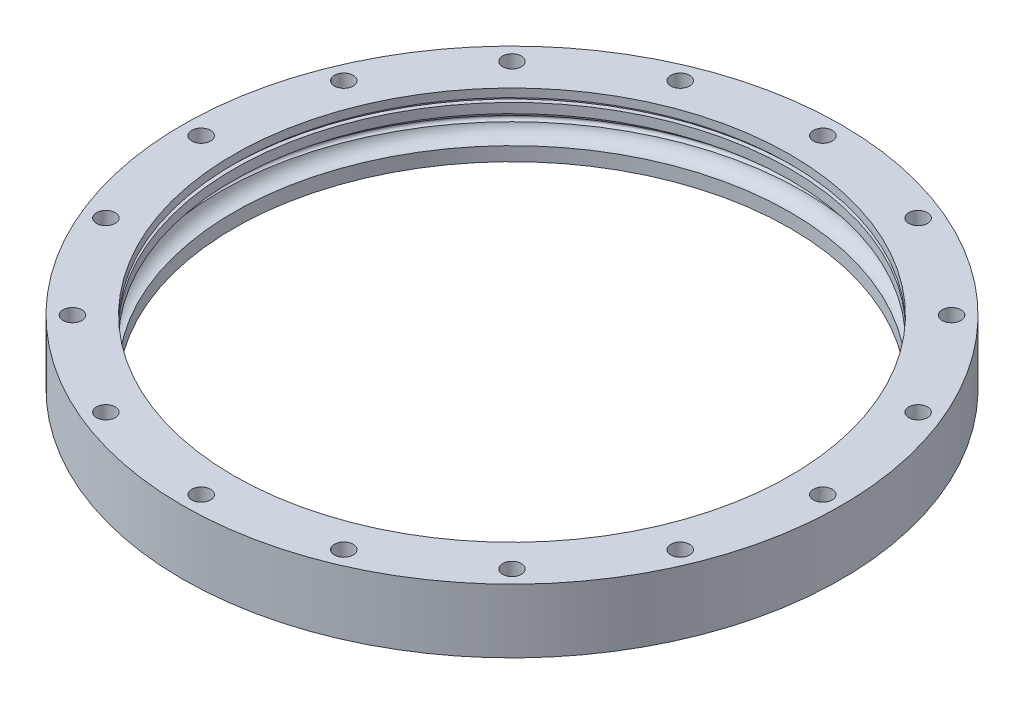
ISO-10303-21;
HEADER;
FILE_DESCRIPTION(('STEP AP214'),'2;1');
FILE_NAME('part.step','',(''),(''),'','','');
FILE_SCHEMA(('AUTOMOTIVE_DESIGN { 1 0 10303 214 1 1 1 1 }'));
ENDSEC;
DATA;
#1=APPLICATION_CONTEXT('core data for automotive mechanical design processes');
#2=APPLICATION_PROTOCOL_DEFINITION('international standard','automotive_design',2000,#1);
#3=PRODUCT_CONTEXT('',#1,'mechanical');
#4=PRODUCT('Part','Part','',(#3));
#5=PRODUCT_RELATED_PRODUCT_CATEGORY('part','',(#4));
#6=PRODUCT_DEFINITION_FORMATION('','',#4);
#7=PRODUCT_DEFINITION_CONTEXT('part definition',#1,'design');
#8=PRODUCT_DEFINITION('design','',#6,#7);
#9=PRODUCT_DEFINITION_SHAPE('','',#8);
#10=(LENGTH_UNIT() NAMED_UNIT(*) SI_UNIT(.MILLI.,.METRE.));
#11=(NAMED_UNIT(*) PLANE_ANGLE_UNIT() SI_UNIT($,.RADIAN.));
#12=(NAMED_UNIT(*) SI_UNIT($,.STERADIAN.) SOLID_ANGLE_UNIT());
#13=UNCERTAINTY_MEASURE_WITH_UNIT(LENGTH_MEASURE(1.E-05),#10,'distance_accuracy_value','');
#14=(GEOMETRIC_REPRESENTATION_CONTEXT(3) GLOBAL_UNCERTAINTY_ASSIGNED_CONTEXT((#13)) GLOBAL_UNIT_ASSIGNED_CONTEXT((#10,
#11,#12)) REPRESENTATION_CONTEXT('',''));
#15=CARTESIAN_POINT('',(0.,0.,0.));
#16=DIRECTION('',(0.,0.,1.));
#17=DIRECTION('',(1.,0.,0.));
#18=AXIS2_PLACEMENT_3D('',#15,#16,#17);
#19=CARTESIAN_POINT('',(-237.5,0.,0.));
#20=DIRECTION('',(0.,-1.,0.));
#21=DIRECTION('',(0.,0.,-1.));
#22=AXIS2_PLACEMENT_3D('',#19,#20,#21);
#23=PLANE('',#22);
#24=CARTESIAN_POINT('',(-206.949015282529,0.,85.7210888497802));
#25=DIRECTION('',(0.,1.,0.));
#26=DIRECTION('',(0.,0.,1.));
#27=AXIS2_PLACEMENT_3D('',#24,#25,#26);
#28=CIRCLE('',#27,6.75000000000141);
#29=CARTESIAN_POINT('',(-206.949015282529,0.,92.4710888497816));
#30=VERTEX_POINT('',#29);
#31=EDGE_CURVE('E162',#30,#30,#28,.T.);
#32=ORIENTED_EDGE('',*,*,#31,.T.);
#33=EDGE_LOOP('',(#32));
#34=FACE_BOUND('',#33,.T.);
#35=CARTESIAN_POINT('',(-158.391918985789,0.,158.391918985785));
#36=DIRECTION('',(0.,1.,0.));
#37=DIRECTION('',(0.,0.,1.));
#38=AXIS2_PLACEMENT_3D('',#35,#36,#37);
#39=CIRCLE('',#38,6.74999999999998);
#40=CARTESIAN_POINT('',(-158.391918985789,0.,165.141918985785));
#41=VERTEX_POINT('',#40);
#42=EDGE_CURVE('E156',#41,#41,#39,.T.);
#43=ORIENTED_EDGE('',*,*,#42,.T.);
#44=EDGE_LOOP('',(#43));
#45=FACE_BOUND('',#44,.T.);
#46=CARTESIAN_POINT('',(-85.7210888497823,0.,206.949015282527));
#47=DIRECTION('',(0.,1.,0.));
#48=DIRECTION('',(0.,0.,1.));
#49=AXIS2_PLACEMENT_3D('',#46,#47,#48);
#50=CIRCLE('',#49,6.74999999999997);
#51=CARTESIAN_POINT('',(-85.7210888497823,0.,213.699015282527));
#52=VERTEX_POINT('',#51);
#53=EDGE_CURVE('E150',#52,#52,#50,.T.);
#54=ORIENTED_EDGE('',*,*,#53,.T.);
#55=EDGE_LOOP('',(#54));
#56=FACE_BOUND('',#55,.T.);
#57=CARTESIAN_POINT('',(-2.31884337140168E-12,0.,224.));
#58=DIRECTION('',(0.,1.,0.));
#59=DIRECTION('',(0.,0.,1.));
#60=AXIS2_PLACEMENT_3D('',#57,#58,#59);
#61=CIRCLE('',#60,6.74999999999998);
#62=CARTESIAN_POINT('',(-2.31884337140168E-12,0.,230.75));
#63=VERTEX_POINT('',#62);
#64=EDGE_CURVE('E144',#63,#63,#61,.T.);
#65=ORIENTED_EDGE('',*,*,#64,.T.);
#66=EDGE_LOOP('',(#65));
#67=FACE_BOUND('',#66,.T.);
#68=CARTESIAN_POINT('',(85.7210888497781,0.,206.949015282529));
#69=DIRECTION('',(0.,1.,0.));
#70=DIRECTION('',(0.,0.,1.));
#71=AXIS2_PLACEMENT_3D('',#68,#69,#70);
#72=CIRCLE('',#71,6.74999999999997);
#73=CARTESIAN_POINT('',(85.7210888497781,0.,213.699015282529));
#74=VERTEX_POINT('',#73);
#75=EDGE_CURVE('E138',#74,#74,#72,.T.);
#76=ORIENTED_EDGE('',*,*,#75,.T.);
#77=EDGE_LOOP('',(#76));
#78=FACE_BOUND('',#77,.T.);
#79=CARTESIAN_POINT('',(158.391918985784,0.,158.391918985789));
#80=DIRECTION('',(0.,1.,0.));
#81=DIRECTION('',(0.,0.,1.));
#82=AXIS2_PLACEMENT_3D('',#79,#80,#81);
#83=CIRCLE('',#82,6.74999999999953);
#84=CARTESIAN_POINT('',(158.391918985784,0.,165.141918985789));
#85=VERTEX_POINT('',#84);
#86=EDGE_CURVE('E132',#85,#85,#83,.T.);
#87=ORIENTED_EDGE('',*,*,#86,.T.);
#88=EDGE_LOOP('',(#87));
#89=FACE_BOUND('',#88,.T.);
#90=CARTESIAN_POINT('',(206.949015282526,0.,85.721088849783));
#91=DIRECTION('',(0.,1.,0.));
#92=DIRECTION('',(0.,0.,1.));
#93=AXIS2_PLACEMENT_3D('',#90,#91,#92);
#94=CIRCLE('',#93,6.74999999999887);
#95=CARTESIAN_POINT('',(206.949015282526,0.,92.4710888497819));
#96=VERTEX_POINT('',#95);
#97=EDGE_CURVE('E126',#96,#96,#94,.T.);
#98=ORIENTED_EDGE('',*,*,#97,.T.);
#99=EDGE_LOOP('',(#98));
#100=FACE_BOUND('',#99,.T.);
#101=CARTESIAN_POINT('',(223.999999999999,0.,3.30069305221058E-12));
#102=DIRECTION('',(0.,1.,0.));
#103=DIRECTION('',(0.,0.,1.));
#104=AXIS2_PLACEMENT_3D('',#101,#102,#103);
#105=CIRCLE('',#104,6.74999999999812);
#106=CARTESIAN_POINT('',(223.999999999999,0.,6.75000000000142));
#107=VERTEX_POINT('',#106);
#108=EDGE_CURVE('E120',#107,#107,#105,.T.);
#109=ORIENTED_EDGE('',*,*,#108,.T.);
#110=EDGE_LOOP('',(#109));
#111=FACE_BOUND('',#110,.T.);
#112=CARTESIAN_POINT('',(206.949015282529,0.,-85.7210888497789));
#113=DIRECTION('',(0.,1.,0.));
#114=DIRECTION('',(0.,0.,1.));
#115=AXIS2_PLACEMENT_3D('',#112,#113,#114);
#116=CIRCLE('',#115,6.75);
#117=CARTESIAN_POINT('',(206.949015282529,0.,-78.9710888497789));
#118=VERTEX_POINT('',#117);
#119=EDGE_CURVE('E114',#118,#118,#116,.T.);
#120=ORIENTED_EDGE('',*,*,#119,.T.);
#121=EDGE_LOOP('',(#120));
#122=FACE_BOUND('',#121,.T.);
#123=CARTESIAN_POINT('',(158.391918985787,0.,-158.391918985786));
#124=DIRECTION('',(0.,1.,0.));
#125=DIRECTION('',(0.,0.,1.));
#126=AXIS2_PLACEMENT_3D('',#123,#124,#125);
#127=CIRCLE('',#126,6.74999999999998);
#128=CARTESIAN_POINT('',(158.391918985787,0.,-151.641918985786));
#129=VERTEX_POINT('',#128);
#130=EDGE_CURVE('E108',#129,#129,#127,.T.);
#131=ORIENTED_EDGE('',*,*,#130,.T.);
#132=EDGE_LOOP('',(#131));
#133=FACE_BOUND('',#132,.T.);
#134=CARTESIAN_POINT('',(85.721088849781,0.,-206.949015282528));
#135=DIRECTION('',(0.,1.,0.));
#136=DIRECTION('',(0.,0.,1.));
#137=AXIS2_PLACEMENT_3D('',#134,#135,#136);
#138=CIRCLE('',#137,6.74999999999996);
#139=CARTESIAN_POINT('',(85.721088849781,0.,-200.199015282528));
#140=VERTEX_POINT('',#139);
#141=EDGE_CURVE('E102',#140,#140,#138,.T.);
#142=ORIENTED_EDGE('',*,*,#141,.T.);
#143=EDGE_LOOP('',(#142));
#144=FACE_BOUND('',#143,.T.);
#145=CARTESIAN_POINT('',(7.54659731599961E-13,0.,-224.));
#146=DIRECTION('',(0.,1.,0.));
#147=DIRECTION('',(0.,0.,1.));
#148=AXIS2_PLACEMENT_3D('',#145,#146,#147);
#149=CIRCLE('',#148,6.74999999999997);
#150=CARTESIAN_POINT('',(7.54659731599961E-13,0.,-217.25));
#151=VERTEX_POINT('',#150);
#152=EDGE_CURVE('E96',#151,#151,#149,.T.);
#153=ORIENTED_EDGE('',*,*,#152,.T.);
#154=EDGE_LOOP('',(#153));
#155=FACE_BOUND('',#154,.T.);
#156=CARTESIAN_POINT('',(-85.7210888497796,0.,-206.949015282529));
#157=DIRECTION('',(0.,1.,0.));
#158=DIRECTION('',(0.,0.,1.));
#159=AXIS2_PLACEMENT_3D('',#156,#157,#158);
#160=CIRCLE('',#159,6.74999999999998);
#161=CARTESIAN_POINT('',(-85.7210888497796,0.,-200.199015282529));
#162=VERTEX_POINT('',#161);
#163=EDGE_CURVE('E90',#162,#162,#160,.T.);
#164=ORIENTED_EDGE('',*,*,#163,.T.);
#165=EDGE_LOOP('',(#164));
#166=FACE_BOUND('',#165,.T.);
#167=CARTESIAN_POINT('',(-158.391918985786,0.,-158.391918985787));
#168=DIRECTION('',(0.,1.,0.));
#169=DIRECTION('',(0.,0.,1.));
#170=AXIS2_PLACEMENT_3D('',#167,#168,#169);
#171=CIRCLE('',#170,6.74999999999998);
#172=CARTESIAN_POINT('',(-158.391918985786,0.,-151.641918985787));
#173=VERTEX_POINT('',#172);
#174=EDGE_CURVE('E84',#173,#173,#171,.T.);
#175=ORIENTED_EDGE('',*,*,#174,.T.);
#176=EDGE_LOOP('',(#175));
#177=FACE_BOUND('',#176,.T.);
#178=CARTESIAN_POINT('',(-206.949015282528,0.,-85.7210888497796));
#179=DIRECTION('',(0.,1.,0.));
#180=DIRECTION('',(0.,0.,1.));
#181=AXIS2_PLACEMENT_3D('',#178,#179,#180);
#182=CIRCLE('',#181,6.7499999999994);
#183=CARTESIAN_POINT('',(-206.949015282528,0.,-78.9710888497802));
#184=VERTEX_POINT('',#183);
#185=EDGE_CURVE('E78',#184,#184,#182,.T.);
#186=ORIENTED_EDGE('',*,*,#185,.T.);
#187=EDGE_LOOP('',(#186));
#188=FACE_BOUND('',#187,.T.);
#189=CARTESIAN_POINT('',(-224.,0.,0.));
#190=DIRECTION('',(0.,1.,0.));
#191=DIRECTION('',(0.,0.,1.));
#192=AXIS2_PLACEMENT_3D('',#189,#190,#191);
#193=CIRCLE('',#192,6.74999999999997);
#194=CARTESIAN_POINT('',(-224.,0.,6.75));
#195=VERTEX_POINT('',#194);
#196=EDGE_CURVE('E74',#195,#195,#193,.T.);
#197=ORIENTED_EDGE('',*,*,#196,.T.);
#198=EDGE_LOOP('',(#197));
#199=FACE_BOUND('',#198,.T.);
#200=CARTESIAN_POINT('',(0.,0.,0.));
#201=DIRECTION('',(0.,1.,0.));
#202=DIRECTION('',(0.,0.,1.));
#203=AXIS2_PLACEMENT_3D('',#200,#201,#202);
#204=CIRCLE('',#203,200.5);
#205=CARTESIAN_POINT('',(0.,0.,200.5));
#206=VERTEX_POINT('',#205);
#207=EDGE_CURVE('E10',#206,#206,#204,.T.);
#208=ORIENTED_EDGE('',*,*,#207,.T.);
#209=EDGE_LOOP('',(#208));
#210=FACE_BOUND('',#209,.T.);
#211=CARTESIAN_POINT('',(0.,0.,0.));
#212=DIRECTION('',(0.,1.,0.));
#213=DIRECTION('',(0.,0.,1.));
#214=AXIS2_PLACEMENT_3D('',#211,#212,#213);
#215=CIRCLE('',#214,237.5);
#216=CARTESIAN_POINT('',(0.,0.,237.5));
#217=VERTEX_POINT('',#216);
#218=EDGE_CURVE('E71',#217,#217,#215,.T.);
#219=ORIENTED_EDGE('',*,*,#218,.F.);
#220=EDGE_LOOP('',(#219));
#221=FACE_BOUND('',#220,.T.);
#222=ADVANCED_FACE('F31',(#34,#45,#56,#67,#78,#89,#100,#111,#122,#133,#144,#155,#166,#177,#188,
#199,#210,#221),#23,.T.);
#223=CARTESIAN_POINT('',(0.,46.,0.));
#224=DIRECTION('',(0.,1.,0.));
#225=DIRECTION('',(0.,0.,1.));
#226=AXIS2_PLACEMENT_3D('',#223,#224,#225);
#227=CYLINDRICAL_SURFACE('',#226,200.5);
#228=CARTESIAN_POINT('',(0.,9.99999999999998,0.));
#229=DIRECTION('',(0.,1.,0.));
#230=DIRECTION('',(0.,0.,1.));
#231=AXIS2_PLACEMENT_3D('',#228,#229,#230);
#232=CIRCLE('',#231,200.5);
#233=CARTESIAN_POINT('',(0.,9.99999999999998,200.5));
#234=VERTEX_POINT('',#233);
#235=EDGE_CURVE('E37',#234,#234,#232,.T.);
#236=ORIENTED_EDGE('',*,*,#235,.T.);
#237=EDGE_LOOP('',(#236));
#238=FACE_BOUND('',#237,.T.);
#239=ORIENTED_EDGE('',*,*,#207,.F.);
#240=EDGE_LOOP('',(#239));
#241=FACE_BOUND('',#240,.T.);
#242=ADVANCED_FACE('F264',(#238,#241),#227,.F.);
#243=CARTESIAN_POINT('',(0.,20.,0.));
#244=DIRECTION('',(0.,1.,0.));
#245=DIRECTION('',(0.,0.,1.));
#246=AXIS2_PLACEMENT_3D('',#243,#244,#245);
#247=TOROIDAL_SURFACE('',#246,200.5,10.);
#248=CARTESIAN_POINT('',(0.,18.0230290524583,0.));
#249=DIRECTION('',(0.,1.,0.));
#250=DIRECTION('',(0.,0.,1.));
#251=AXIS2_PLACEMENT_3D('',#248,#249,#250);
#252=CIRCLE('',#251,210.302631578947);
#253=CARTESIAN_POINT('',(0.,18.0230290524583,210.302631578947));
#254=VERTEX_POINT('',#253);
#255=EDGE_CURVE('E41',#254,#254,#252,.T.);
#256=ORIENTED_EDGE('',*,*,#255,.T.);
#257=EDGE_LOOP('',(#256));
#258=FACE_BOUND('',#257,.T.);
#259=ORIENTED_EDGE('',*,*,#235,.F.);
#260=EDGE_LOOP('',(#259));
#261=FACE_BOUND('',#260,.T.);
#262=ADVANCED_FACE('F258',(#258,#261),#247,.F.);
#263=CARTESIAN_POINT('',(0.,20.,0.));
#264=DIRECTION('',(0.,1.,0.));
#265=DIRECTION('',(0.,0.,1.));
#266=AXIS2_PLACEMENT_3D('',#263,#264,#265);
#267=TOROIDAL_SURFACE('',#266,210.,2.);
#268=CARTESIAN_POINT('',(0.,21.9769709475417,0.));
#269=DIRECTION('',(0.,1.,0.));
#270=DIRECTION('',(0.,0.,1.));
#271=AXIS2_PLACEMENT_3D('',#268,#269,#270);
#272=CIRCLE('',#271,210.302631578947);
#273=CARTESIAN_POINT('',(0.,21.9769709475417,210.302631578947));
#274=VERTEX_POINT('',#273);
#275=EDGE_CURVE('E45',#274,#274,#272,.T.);
#276=ORIENTED_EDGE('',*,*,#275,.T.);
#277=EDGE_LOOP('',(#276));
#278=FACE_BOUND('',#277,.T.);
#279=ORIENTED_EDGE('',*,*,#255,.F.);
#280=EDGE_LOOP('',(#279));
#281=FACE_BOUND('',#280,.T.);
#282=ADVANCED_FACE('F252',(#278,#281),#267,.F.);
#283=CARTESIAN_POINT('',(0.,20.,0.));
#284=DIRECTION('',(0.,1.,0.));
#285=DIRECTION('',(0.,0.,1.));
#286=AXIS2_PLACEMENT_3D('',#283,#284,#285);
#287=TOROIDAL_SURFACE('',#286,200.5,10.);
#288=CARTESIAN_POINT('',(0.,30.,0.));
#289=DIRECTION('',(0.,1.,0.));
#290=DIRECTION('',(0.,0.,1.));
#291=AXIS2_PLACEMENT_3D('',#288,#289,#290);
#292=CIRCLE('',#291,200.5);
#293=CARTESIAN_POINT('',(0.,30.,200.5));
#294=VERTEX_POINT('',#293);
#295=EDGE_CURVE('E50',#294,#294,#292,.T.);
#296=ORIENTED_EDGE('',*,*,#295,.T.);
#297=EDGE_LOOP('',(#296));
#298=FACE_BOUND('',#297,.T.);
#299=ORIENTED_EDGE('',*,*,#275,.F.);
#300=EDGE_LOOP('',(#299));
#301=FACE_BOUND('',#300,.T.);
#302=ADVANCED_FACE('F246',(#298,#301),#287,.F.);
#303=CARTESIAN_POINT('',(0.,46.,0.));
#304=DIRECTION('',(0.,1.,0.));
#305=DIRECTION('',(0.,0.,1.));
#306=AXIS2_PLACEMENT_3D('',#303,#304,#305);
#307=CYLINDRICAL_SURFACE('',#306,200.5);
#308=CARTESIAN_POINT('',(0.,37.,0.));
#309=DIRECTION('',(0.,1.,0.));
#310=DIRECTION('',(0.,0.,1.));
#311=AXIS2_PLACEMENT_3D('',#308,#309,#310);
#312=CIRCLE('',#311,200.5);
#313=CARTESIAN_POINT('',(0.,37.,200.5));
#314=VERTEX_POINT('',#313);
#315=EDGE_CURVE('E53',#314,#314,#312,.T.);
#316=ORIENTED_EDGE('',*,*,#315,.T.);
#317=EDGE_LOOP('',(#316));
#318=FACE_BOUND('',#317,.T.);
#319=ORIENTED_EDGE('',*,*,#295,.F.);
#320=EDGE_LOOP('',(#319));
#321=FACE_BOUND('',#320,.T.);
#322=ADVANCED_FACE('F240',(#318,#321),#307,.F.);
#323=CARTESIAN_POINT('',(-203.5,37.,0.));
#324=DIRECTION('',(0.,1.,0.));
#325=DIRECTION('',(0.,0.,1.));
#326=AXIS2_PLACEMENT_3D('',#323,#324,#325);
#327=PLANE('',#326);
#328=CARTESIAN_POINT('',(0.,37.,0.));
#329=DIRECTION('',(0.,1.,0.));
#330=DIRECTION('',(0.,0.,1.));
#331=AXIS2_PLACEMENT_3D('',#328,#329,#330);
#332=CIRCLE('',#331,203.5);
#333=CARTESIAN_POINT('',(0.,37.,203.5));
#334=VERTEX_POINT('',#333);
#335=EDGE_CURVE('E56',#334,#334,#332,.T.);
#336=ORIENTED_EDGE('',*,*,#335,.T.);
#337=EDGE_LOOP('',(#336));
#338=FACE_BOUND('',#337,.T.);
#339=ORIENTED_EDGE('',*,*,#315,.F.);
#340=EDGE_LOOP('',(#339));
#341=FACE_BOUND('',#340,.T.);
#342=ADVANCED_FACE('F234',(#338,#341),#327,.T.);
#343=CARTESIAN_POINT('',(0.,46.,0.));
#344=DIRECTION('',(0.,1.,0.));
#345=DIRECTION('',(0.,0.,1.));
#346=AXIS2_PLACEMENT_3D('',#343,#344,#345);
#347=CYLINDRICAL_SURFACE('',#346,203.5);
#348=CARTESIAN_POINT('',(0.,40.,0.));
#349=DIRECTION('',(0.,1.,0.));
#350=DIRECTION('',(0.,0.,1.));
#351=AXIS2_PLACEMENT_3D('',#348,#349,#350);
#352=CIRCLE('',#351,203.5);
#353=CARTESIAN_POINT('',(0.,40.,203.5));
#354=VERTEX_POINT('',#353);
#355=EDGE_CURVE('E59',#354,#354,#352,.T.);
#356=ORIENTED_EDGE('',*,*,#355,.T.);
#357=EDGE_LOOP('',(#356));
#358=FACE_BOUND('',#357,.T.);
#359=ORIENTED_EDGE('',*,*,#335,.F.);
#360=EDGE_LOOP('',(#359));
#361=FACE_BOUND('',#360,.T.);
#362=ADVANCED_FACE('F228',(#358,#361),#347,.F.);
#363=CARTESIAN_POINT('',(-200.5,40.,0.));
#364=DIRECTION('',(0.,-1.,0.));
#365=DIRECTION('',(0.,0.,-1.));
#366=AXIS2_PLACEMENT_3D('',#363,#364,#365);
#367=PLANE('',#366);
#368=CARTESIAN_POINT('',(0.,40.,0.));
#369=DIRECTION('',(0.,1.,0.));
#370=DIRECTION('',(0.,0.,1.));
#371=AXIS2_PLACEMENT_3D('',#368,#369,#370);
#372=CIRCLE('',#371,200.5);
#373=CARTESIAN_POINT('',(0.,40.,200.5));
#374=VERTEX_POINT('',#373);
#375=EDGE_CURVE('E62',#374,#374,#372,.T.);
#376=ORIENTED_EDGE('',*,*,#375,.T.);
#377=EDGE_LOOP('',(#376));
#378=FACE_BOUND('',#377,.T.);
#379=ORIENTED_EDGE('',*,*,#355,.F.);
#380=EDGE_LOOP('',(#379));
#381=FACE_BOUND('',#380,.T.);
#382=ADVANCED_FACE('F222',(#378,#381),#367,.T.);
#383=CARTESIAN_POINT('',(0.,46.,0.));
#384=DIRECTION('',(0.,1.,0.));
#385=DIRECTION('',(0.,0.,1.));
#386=AXIS2_PLACEMENT_3D('',#383,#384,#385);
#387=CYLINDRICAL_SURFACE('',#386,200.5);
#388=CARTESIAN_POINT('',(0.,46.,0.));
#389=DIRECTION('',(0.,1.,0.));
#390=DIRECTION('',(0.,0.,1.));
#391=AXIS2_PLACEMENT_3D('',#388,#389,#390);
#392=CIRCLE('',#391,200.5);
#393=CARTESIAN_POINT('',(0.,46.,200.5));
#394=VERTEX_POINT('',#393);
#395=EDGE_CURVE('E65',#394,#394,#392,.T.);
#396=ORIENTED_EDGE('',*,*,#395,.T.);
#397=EDGE_LOOP('',(#396));
#398=FACE_BOUND('',#397,.T.);
#399=ORIENTED_EDGE('',*,*,#375,.F.);
#400=EDGE_LOOP('',(#399));
#401=FACE_BOUND('',#400,.T.);
#402=ADVANCED_FACE('F184',(#398,#401),#387,.F.);
#403=CARTESIAN_POINT('',(-200.5,46.,0.));
#404=DIRECTION('',(0.,1.,0.));
#405=DIRECTION('',(0.,0.,1.));
#406=AXIS2_PLACEMENT_3D('',#403,#404,#405);
#407=PLANE('',#406);
#408=CARTESIAN_POINT('',(-206.949015282529,46.,85.7210888497802));
#409=DIRECTION('',(0.,1.,0.));
#410=DIRECTION('',(0.,0.,1.));
#411=AXIS2_PLACEMENT_3D('',#408,#409,#410);
#412=CIRCLE('',#411,6.75000000000141);
#413=CARTESIAN_POINT('',(-206.949015282529,46.,92.4710888497816));
#414=VERTEX_POINT('',#413);
#415=EDGE_CURVE('E165',#414,#414,#412,.T.);
#416=ORIENTED_EDGE('',*,*,#415,.F.);
#417=EDGE_LOOP('',(#416));
#418=FACE_BOUND('',#417,.T.);
#419=CARTESIAN_POINT('',(-158.391918985789,46.,158.391918985785));
#420=DIRECTION('',(0.,1.,0.));
#421=DIRECTION('',(0.,0.,1.));
#422=AXIS2_PLACEMENT_3D('',#419,#420,#421);
#423=CIRCLE('',#422,6.74999999999998);
#424=CARTESIAN_POINT('',(-158.391918985789,46.,165.141918985785));
#425=VERTEX_POINT('',#424);
#426=EDGE_CURVE('E159',#425,#425,#423,.T.);
#427=ORIENTED_EDGE('',*,*,#426,.F.);
#428=EDGE_LOOP('',(#427));
#429=FACE_BOUND('',#428,.T.);
#430=CARTESIAN_POINT('',(-85.7210888497823,46.,206.949015282527));
#431=DIRECTION('',(0.,1.,0.));
#432=DIRECTION('',(0.,0.,1.));
#433=AXIS2_PLACEMENT_3D('',#430,#431,#432);
#434=CIRCLE('',#433,6.74999999999997);
#435=CARTESIAN_POINT('',(-85.7210888497823,46.,213.699015282527));
#436=VERTEX_POINT('',#435);
#437=EDGE_CURVE('E153',#436,#436,#434,.T.);
#438=ORIENTED_EDGE('',*,*,#437,.F.);
#439=EDGE_LOOP('',(#438));
#440=FACE_BOUND('',#439,.T.);
#441=CARTESIAN_POINT('',(-2.31884337140168E-12,46.,224.));
#442=DIRECTION('',(0.,1.,0.));
#443=DIRECTION('',(0.,0.,1.));
#444=AXIS2_PLACEMENT_3D('',#441,#442,#443);
#445=CIRCLE('',#444,6.74999999999998);
#446=CARTESIAN_POINT('',(-2.31884337140168E-12,46.,230.75));
#447=VERTEX_POINT('',#446);
#448=EDGE_CURVE('E147',#447,#447,#445,.T.);
#449=ORIENTED_EDGE('',*,*,#448,.F.);
#450=EDGE_LOOP('',(#449));
#451=FACE_BOUND('',#450,.T.);
#452=CARTESIAN_POINT('',(85.7210888497781,46.,206.949015282529));
#453=DIRECTION('',(0.,1.,0.));
#454=DIRECTION('',(0.,0.,1.));
#455=AXIS2_PLACEMENT_3D('',#452,#453,#454);
#456=CIRCLE('',#455,6.74999999999997);
#457=CARTESIAN_POINT('',(85.7210888497781,46.,213.699015282529));
#458=VERTEX_POINT('',#457);
#459=EDGE_CURVE('E141',#458,#458,#456,.T.);
#460=ORIENTED_EDGE('',*,*,#459,.F.);
#461=EDGE_LOOP('',(#460));
#462=FACE_BOUND('',#461,.T.);
#463=CARTESIAN_POINT('',(158.391918985784,46.,158.391918985789));
#464=DIRECTION('',(0.,1.,0.));
#465=DIRECTION('',(0.,0.,1.));
#466=AXIS2_PLACEMENT_3D('',#463,#464,#465);
#467=CIRCLE('',#466,6.74999999999953);
#468=CARTESIAN_POINT('',(158.391918985784,46.,165.141918985789));
#469=VERTEX_POINT('',#468);
#470=EDGE_CURVE('E135',#469,#469,#467,.T.);
#471=ORIENTED_EDGE('',*,*,#470,.F.);
#472=EDGE_LOOP('',(#471));
#473=FACE_BOUND('',#472,.T.);
#474=CARTESIAN_POINT('',(206.949015282526,46.,85.721088849783));
#475=DIRECTION('',(0.,1.,0.));
#476=DIRECTION('',(0.,0.,1.));
#477=AXIS2_PLACEMENT_3D('',#474,#475,#476);
#478=CIRCLE('',#477,6.74999999999887);
#479=CARTESIAN_POINT('',(206.949015282526,46.,92.4710888497819));
#480=VERTEX_POINT('',#479);
#481=EDGE_CURVE('E129',#480,#480,#478,.T.);
#482=ORIENTED_EDGE('',*,*,#481,.F.);
#483=EDGE_LOOP('',(#482));
#484=FACE_BOUND('',#483,.T.);
#485=CARTESIAN_POINT('',(223.999999999999,46.,3.30069305221058E-12));
#486=DIRECTION('',(0.,1.,0.));
#487=DIRECTION('',(0.,0.,1.));
#488=AXIS2_PLACEMENT_3D('',#485,#486,#487);
#489=CIRCLE('',#488,6.74999999999812);
#490=CARTESIAN_POINT('',(223.999999999999,46.,6.75000000000142));
#491=VERTEX_POINT('',#490);
#492=EDGE_CURVE('E123',#491,#491,#489,.T.);
#493=ORIENTED_EDGE('',*,*,#492,.F.);
#494=EDGE_LOOP('',(#493));
#495=FACE_BOUND('',#494,.T.);
#496=CARTESIAN_POINT('',(206.949015282529,46.,-85.7210888497789));
#497=DIRECTION('',(0.,1.,0.));
#498=DIRECTION('',(0.,0.,1.));
#499=AXIS2_PLACEMENT_3D('',#496,#497,#498);
#500=CIRCLE('',#499,6.75);
#501=CARTESIAN_POINT('',(206.949015282529,46.,-78.9710888497789));
#502=VERTEX_POINT('',#501);
#503=EDGE_CURVE('E117',#502,#502,#500,.T.);
#504=ORIENTED_EDGE('',*,*,#503,.F.);
#505=EDGE_LOOP('',(#504));
#506=FACE_BOUND('',#505,.T.);
#507=CARTESIAN_POINT('',(158.391918985787,46.,-158.391918985786));
#508=DIRECTION('',(0.,1.,0.));
#509=DIRECTION('',(0.,0.,1.));
#510=AXIS2_PLACEMENT_3D('',#507,#508,#509);
#511=CIRCLE('',#510,6.74999999999998);
#512=CARTESIAN_POINT('',(158.391918985787,46.,-151.641918985786));
#513=VERTEX_POINT('',#512);
#514=EDGE_CURVE('E111',#513,#513,#511,.T.);
#515=ORIENTED_EDGE('',*,*,#514,.F.);
#516=EDGE_LOOP('',(#515));
#517=FACE_BOUND('',#516,.T.);
#518=CARTESIAN_POINT('',(85.721088849781,46.,-206.949015282528));
#519=DIRECTION('',(0.,1.,0.));
#520=DIRECTION('',(0.,0.,1.));
#521=AXIS2_PLACEMENT_3D('',#518,#519,#520);
#522=CIRCLE('',#521,6.74999999999996);
#523=CARTESIAN_POINT('',(85.721088849781,46.,-200.199015282528));
#524=VERTEX_POINT('',#523);
#525=EDGE_CURVE('E105',#524,#524,#522,.T.);
#526=ORIENTED_EDGE('',*,*,#525,.F.);
#527=EDGE_LOOP('',(#526));
#528=FACE_BOUND('',#527,.T.);
#529=CARTESIAN_POINT('',(7.54659731599961E-13,46.,-224.));
#530=DIRECTION('',(0.,1.,0.));
#531=DIRECTION('',(0.,0.,1.));
#532=AXIS2_PLACEMENT_3D('',#529,#530,#531);
#533=CIRCLE('',#532,6.74999999999997);
#534=CARTESIAN_POINT('',(7.54659731599961E-13,46.,-217.25));
#535=VERTEX_POINT('',#534);
#536=EDGE_CURVE('E99',#535,#535,#533,.T.);
#537=ORIENTED_EDGE('',*,*,#536,.F.);
#538=EDGE_LOOP('',(#537));
#539=FACE_BOUND('',#538,.T.);
#540=CARTESIAN_POINT('',(-85.7210888497796,46.,-206.949015282529));
#541=DIRECTION('',(0.,1.,0.));
#542=DIRECTION('',(0.,0.,1.));
#543=AXIS2_PLACEMENT_3D('',#540,#541,#542);
#544=CIRCLE('',#543,6.74999999999998);
#545=CARTESIAN_POINT('',(-85.7210888497796,46.,-200.199015282529));
#546=VERTEX_POINT('',#545);
#547=EDGE_CURVE('E93',#546,#546,#544,.T.);
#548=ORIENTED_EDGE('',*,*,#547,.F.);
#549=EDGE_LOOP('',(#548));
#550=FACE_BOUND('',#549,.T.);
#551=CARTESIAN_POINT('',(-158.391918985786,46.,-158.391918985787));
#552=DIRECTION('',(0.,1.,0.));
#553=DIRECTION('',(0.,0.,1.));
#554=AXIS2_PLACEMENT_3D('',#551,#552,#553);
#555=CIRCLE('',#554,6.74999999999998);
#556=CARTESIAN_POINT('',(-158.391918985786,46.,-151.641918985787));
#557=VERTEX_POINT('',#556);
#558=EDGE_CURVE('E87',#557,#557,#555,.T.);
#559=ORIENTED_EDGE('',*,*,#558,.F.);
#560=EDGE_LOOP('',(#559));
#561=FACE_BOUND('',#560,.T.);
#562=CARTESIAN_POINT('',(-206.949015282528,46.,-85.7210888497796));
#563=DIRECTION('',(0.,1.,0.));
#564=DIRECTION('',(0.,0.,1.));
#565=AXIS2_PLACEMENT_3D('',#562,#563,#564);
#566=CIRCLE('',#565,6.7499999999994);
#567=CARTESIAN_POINT('',(-206.949015282528,46.,-78.9710888497802));
#568=VERTEX_POINT('',#567);
#569=EDGE_CURVE('E81',#568,#568,#566,.T.);
#570=ORIENTED_EDGE('',*,*,#569,.F.);
#571=EDGE_LOOP('',(#570));
#572=FACE_BOUND('',#571,.T.);
#573=CARTESIAN_POINT('',(-224.,46.,0.));
#574=DIRECTION('',(0.,1.,0.));
#575=DIRECTION('',(0.,0.,1.));
#576=AXIS2_PLACEMENT_3D('',#573,#574,#575);
#577=CIRCLE('',#576,6.74999999999997);
#578=CARTESIAN_POINT('',(-224.,46.,6.75));
#579=VERTEX_POINT('',#578);
#580=EDGE_CURVE('E75',#579,#579,#577,.T.);
#581=ORIENTED_EDGE('',*,*,#580,.F.);
#582=EDGE_LOOP('',(#581));
#583=FACE_BOUND('',#582,.T.);
#584=CARTESIAN_POINT('',(0.,46.,0.));
#585=DIRECTION('',(0.,1.,0.));
#586=DIRECTION('',(0.,0.,1.));
#587=AXIS2_PLACEMENT_3D('',#584,#585,#586);
#588=CIRCLE('',#587,237.5);
#589=CARTESIAN_POINT('',(0.,46.,237.5));
#590=VERTEX_POINT('',#589);
#591=EDGE_CURVE('E68',#590,#590,#588,.T.);
#592=ORIENTED_EDGE('',*,*,#591,.T.);
#593=EDGE_LOOP('',(#592));
#594=FACE_BOUND('',#593,.T.);
#595=ORIENTED_EDGE('',*,*,#395,.F.);
#596=EDGE_LOOP('',(#595));
#597=FACE_BOUND('',#596,.T.);
#598=ADVANCED_FACE('F180',(#418,#429,#440,#451,#462,#473,#484,#495,#506,#517,#528,#539,#550,
#561,#572,#583,#594,#597),#407,.T.);
#599=CARTESIAN_POINT('',(0.,46.,0.));
#600=DIRECTION('',(0.,1.,0.));
#601=DIRECTION('',(0.,0.,1.));
#602=AXIS2_PLACEMENT_3D('',#599,#600,#601);
#603=CYLINDRICAL_SURFACE('',#602,237.5);
#604=ORIENTED_EDGE('',*,*,#218,.T.);
#605=EDGE_LOOP('',(#604));
#606=FACE_BOUND('',#605,.T.);
#607=ORIENTED_EDGE('',*,*,#591,.F.);
#608=EDGE_LOOP('',(#607));
#609=FACE_BOUND('',#608,.T.);
#610=ADVANCED_FACE('F183',(#606,#609),#603,.T.);
#611=CARTESIAN_POINT('',(-224.,0.,0.));
#612=DIRECTION('',(0.,1.,0.));
#613=DIRECTION('',(0.,0.,1.));
#614=AXIS2_PLACEMENT_3D('',#611,#612,#613);
#615=CYLINDRICAL_SURFACE('',#614,6.74999999999997);
#616=ORIENTED_EDGE('',*,*,#196,.F.);
#617=EDGE_LOOP('',(#616));
#618=FACE_BOUND('',#617,.T.);
#619=ORIENTED_EDGE('',*,*,#580,.T.);
#620=EDGE_LOOP('',(#619));
#621=FACE_BOUND('',#620,.T.);
#622=ADVANCED_FACE('F332',(#618,#621),#615,.F.);
#623=CARTESIAN_POINT('',(-206.949015282528,0.,-85.7210888497796));
#624=DIRECTION('',(0.,1.,0.));
#625=DIRECTION('',(0.,0.,1.));
#626=AXIS2_PLACEMENT_3D('',#623,#624,#625);
#627=CYLINDRICAL_SURFACE('',#626,6.7499999999994);
#628=ORIENTED_EDGE('',*,*,#185,.F.);
#629=EDGE_LOOP('',(#628));
#630=FACE_BOUND('',#629,.T.);
#631=ORIENTED_EDGE('',*,*,#569,.T.);
#632=EDGE_LOOP('',(#631));
#633=FACE_BOUND('',#632,.T.);
#634=ADVANCED_FACE('F344',(#630,#633),#627,.F.);
#635=CARTESIAN_POINT('',(-158.391918985786,0.,-158.391918985787));
#636=DIRECTION('',(0.,1.,0.));
#637=DIRECTION('',(0.,0.,1.));
#638=AXIS2_PLACEMENT_3D('',#635,#636,#637);
#639=CYLINDRICAL_SURFACE('',#638,6.74999999999998);
#640=ORIENTED_EDGE('',*,*,#174,.F.);
#641=EDGE_LOOP('',(#640));
#642=FACE_BOUND('',#641,.T.);
#643=ORIENTED_EDGE('',*,*,#558,.T.);
#644=EDGE_LOOP('',(#643));
#645=FACE_BOUND('',#644,.T.);
#646=ADVANCED_FACE('F351',(#642,#645),#639,.F.);
#647=CARTESIAN_POINT('',(-85.7210888497796,0.,-206.949015282529));
#648=DIRECTION('',(0.,1.,0.));
#649=DIRECTION('',(0.,0.,1.));
#650=AXIS2_PLACEMENT_3D('',#647,#648,#649);
#651=CYLINDRICAL_SURFACE('',#650,6.74999999999998);
#652=ORIENTED_EDGE('',*,*,#163,.F.);
#653=EDGE_LOOP('',(#652));
#654=FACE_BOUND('',#653,.T.);
#655=ORIENTED_EDGE('',*,*,#547,.T.);
#656=EDGE_LOOP('',(#655));
#657=FACE_BOUND('',#656,.T.);
#658=ADVANCED_FACE('F359',(#654,#657),#651,.F.);
#659=CARTESIAN_POINT('',(7.54659731599961E-13,0.,-224.));
#660=DIRECTION('',(0.,1.,0.));
#661=DIRECTION('',(0.,0.,1.));
#662=AXIS2_PLACEMENT_3D('',#659,#660,#661);
#663=CYLINDRICAL_SURFACE('',#662,6.74999999999997);
#664=ORIENTED_EDGE('',*,*,#152,.F.);
#665=EDGE_LOOP('',(#664));
#666=FACE_BOUND('',#665,.T.);
#667=ORIENTED_EDGE('',*,*,#536,.T.);
#668=EDGE_LOOP('',(#667));
#669=FACE_BOUND('',#668,.T.);
#670=ADVANCED_FACE('F367',(#666,#669),#663,.F.);
#671=CARTESIAN_POINT('',(85.721088849781,0.,-206.949015282528));
#672=DIRECTION('',(0.,1.,0.));
#673=DIRECTION('',(0.,0.,1.));
#674=AXIS2_PLACEMENT_3D('',#671,#672,#673);
#675=CYLINDRICAL_SURFACE('',#674,6.74999999999996);
#676=ORIENTED_EDGE('',*,*,#141,.F.);
#677=EDGE_LOOP('',(#676));
#678=FACE_BOUND('',#677,.T.);
#679=ORIENTED_EDGE('',*,*,#525,.T.);
#680=EDGE_LOOP('',(#679));
#681=FACE_BOUND('',#680,.T.);
#682=ADVANCED_FACE('F375',(#678,#681),#675,.F.);
#683=CARTESIAN_POINT('',(158.391918985787,0.,-158.391918985786));
#684=DIRECTION('',(0.,1.,0.));
#685=DIRECTION('',(0.,0.,1.));
#686=AXIS2_PLACEMENT_3D('',#683,#684,#685);
#687=CYLINDRICAL_SURFACE('',#686,6.74999999999998);
#688=ORIENTED_EDGE('',*,*,#130,.F.);
#689=EDGE_LOOP('',(#688));
#690=FACE_BOUND('',#689,.T.);
#691=ORIENTED_EDGE('',*,*,#514,.T.);
#692=EDGE_LOOP('',(#691));
#693=FACE_BOUND('',#692,.T.);
#694=ADVANCED_FACE('F383',(#690,#693),#687,.F.);
#695=CARTESIAN_POINT('',(206.949015282529,0.,-85.7210888497789));
#696=DIRECTION('',(0.,1.,0.));
#697=DIRECTION('',(0.,0.,1.));
#698=AXIS2_PLACEMENT_3D('',#695,#696,#697);
#699=CYLINDRICAL_SURFACE('',#698,6.75);
#700=ORIENTED_EDGE('',*,*,#119,.F.);
#701=EDGE_LOOP('',(#700));
#702=FACE_BOUND('',#701,.T.);
#703=ORIENTED_EDGE('',*,*,#503,.T.);
#704=EDGE_LOOP('',(#703));
#705=FACE_BOUND('',#704,.T.);
#706=ADVANCED_FACE('F391',(#702,#705),#699,.F.);
#707=CARTESIAN_POINT('',(223.999999999999,0.,3.30069305221058E-12));
#708=DIRECTION('',(0.,1.,0.));
#709=DIRECTION('',(0.,0.,1.));
#710=AXIS2_PLACEMENT_3D('',#707,#708,#709);
#711=CYLINDRICAL_SURFACE('',#710,6.74999999999812);
#712=ORIENTED_EDGE('',*,*,#108,.F.);
#713=EDGE_LOOP('',(#712));
#714=FACE_BOUND('',#713,.T.);
#715=ORIENTED_EDGE('',*,*,#492,.T.);
#716=EDGE_LOOP('',(#715));
#717=FACE_BOUND('',#716,.T.);
#718=ADVANCED_FACE('F399',(#714,#717),#711,.F.);
#719=CARTESIAN_POINT('',(206.949015282526,0.,85.721088849783));
#720=DIRECTION('',(0.,1.,0.));
#721=DIRECTION('',(0.,0.,1.));
#722=AXIS2_PLACEMENT_3D('',#719,#720,#721);
#723=CYLINDRICAL_SURFACE('',#722,6.74999999999887);
#724=ORIENTED_EDGE('',*,*,#97,.F.);
#725=EDGE_LOOP('',(#724));
#726=FACE_BOUND('',#725,.T.);
#727=ORIENTED_EDGE('',*,*,#481,.T.);
#728=EDGE_LOOP('',(#727));
#729=FACE_BOUND('',#728,.T.);
#730=ADVANCED_FACE('F407',(#726,#729),#723,.F.);
#731=CARTESIAN_POINT('',(158.391918985784,0.,158.391918985789));
#732=DIRECTION('',(0.,1.,0.));
#733=DIRECTION('',(0.,0.,1.));
#734=AXIS2_PLACEMENT_3D('',#731,#732,#733);
#735=CYLINDRICAL_SURFACE('',#734,6.74999999999953);
#736=ORIENTED_EDGE('',*,*,#86,.F.);
#737=EDGE_LOOP('',(#736));
#738=FACE_BOUND('',#737,.T.);
#739=ORIENTED_EDGE('',*,*,#470,.T.);
#740=EDGE_LOOP('',(#739));
#741=FACE_BOUND('',#740,.T.);
#742=ADVANCED_FACE('F415',(#738,#741),#735,.F.);
#743=CARTESIAN_POINT('',(85.7210888497781,0.,206.949015282529));
#744=DIRECTION('',(0.,1.,0.));
#745=DIRECTION('',(0.,0.,1.));
#746=AXIS2_PLACEMENT_3D('',#743,#744,#745);
#747=CYLINDRICAL_SURFACE('',#746,6.74999999999997);
#748=ORIENTED_EDGE('',*,*,#75,.F.);
#749=EDGE_LOOP('',(#748));
#750=FACE_BOUND('',#749,.T.);
#751=ORIENTED_EDGE('',*,*,#459,.T.);
#752=EDGE_LOOP('',(#751));
#753=FACE_BOUND('',#752,.T.);
#754=ADVANCED_FACE('F423',(#750,#753),#747,.F.);
#755=CARTESIAN_POINT('',(-2.31884337140168E-12,0.,224.));
#756=DIRECTION('',(0.,1.,0.));
#757=DIRECTION('',(0.,0.,1.));
#758=AXIS2_PLACEMENT_3D('',#755,#756,#757);
#759=CYLINDRICAL_SURFACE('',#758,6.74999999999998);
#760=ORIENTED_EDGE('',*,*,#64,.F.);
#761=EDGE_LOOP('',(#760));
#762=FACE_BOUND('',#761,.T.);
#763=ORIENTED_EDGE('',*,*,#448,.T.);
#764=EDGE_LOOP('',(#763));
#765=FACE_BOUND('',#764,.T.);
#766=ADVANCED_FACE('F431',(#762,#765),#759,.F.);
#767=CARTESIAN_POINT('',(-85.7210888497823,0.,206.949015282527));
#768=DIRECTION('',(0.,1.,0.));
#769=DIRECTION('',(0.,0.,1.));
#770=AXIS2_PLACEMENT_3D('',#767,#768,#769);
#771=CYLINDRICAL_SURFACE('',#770,6.74999999999997);
#772=ORIENTED_EDGE('',*,*,#53,.F.);
#773=EDGE_LOOP('',(#772));
#774=FACE_BOUND('',#773,.T.);
#775=ORIENTED_EDGE('',*,*,#437,.T.);
#776=EDGE_LOOP('',(#775));
#777=FACE_BOUND('',#776,.T.);
#778=ADVANCED_FACE('F439',(#774,#777),#771,.F.);
#779=CARTESIAN_POINT('',(-158.391918985789,0.,158.391918985785));
#780=DIRECTION('',(0.,1.,0.));
#781=DIRECTION('',(0.,0.,1.));
#782=AXIS2_PLACEMENT_3D('',#779,#780,#781);
#783=CYLINDRICAL_SURFACE('',#782,6.74999999999998);
#784=ORIENTED_EDGE('',*,*,#42,.F.);
#785=EDGE_LOOP('',(#784));
#786=FACE_BOUND('',#785,.T.);
#787=ORIENTED_EDGE('',*,*,#426,.T.);
#788=EDGE_LOOP('',(#787));
#789=FACE_BOUND('',#788,.T.);
#790=ADVANCED_FACE('F176',(#786,#789),#783,.F.);
#791=CARTESIAN_POINT('',(-206.949015282529,0.,85.7210888497802));
#792=DIRECTION('',(0.,1.,0.));
#793=DIRECTION('',(0.,0.,1.));
#794=AXIS2_PLACEMENT_3D('',#791,#792,#793);
#795=CYLINDRICAL_SURFACE('',#794,6.75000000000141);
#796=ORIENTED_EDGE('',*,*,#31,.F.);
#797=EDGE_LOOP('',(#796));
#798=FACE_BOUND('',#797,.T.);
#799=ORIENTED_EDGE('',*,*,#415,.T.);
#800=EDGE_LOOP('',(#799));
#801=FACE_BOUND('',#800,.T.);
#802=ADVANCED_FACE('F173',(#798,#801),#795,.F.);
#803=CLOSED_SHELL('',(#222,#242,#262,#282,#302,#322,#342,#362,#382,#402,#598,#610,#622,#634,
#646,#658,#670,#682,#694,#706,#718,#730,#742,#754,#766,#778,#790,#802));
#804=MANIFOLD_SOLID_BREP('B2',#803);
#805=ADVANCED_BREP_SHAPE_REPRESENTATION('',(#18,#804),#14);
#806=SHAPE_DEFINITION_REPRESENTATION(#9,#805);
ENDSEC;
END-ISO-10303-21;
